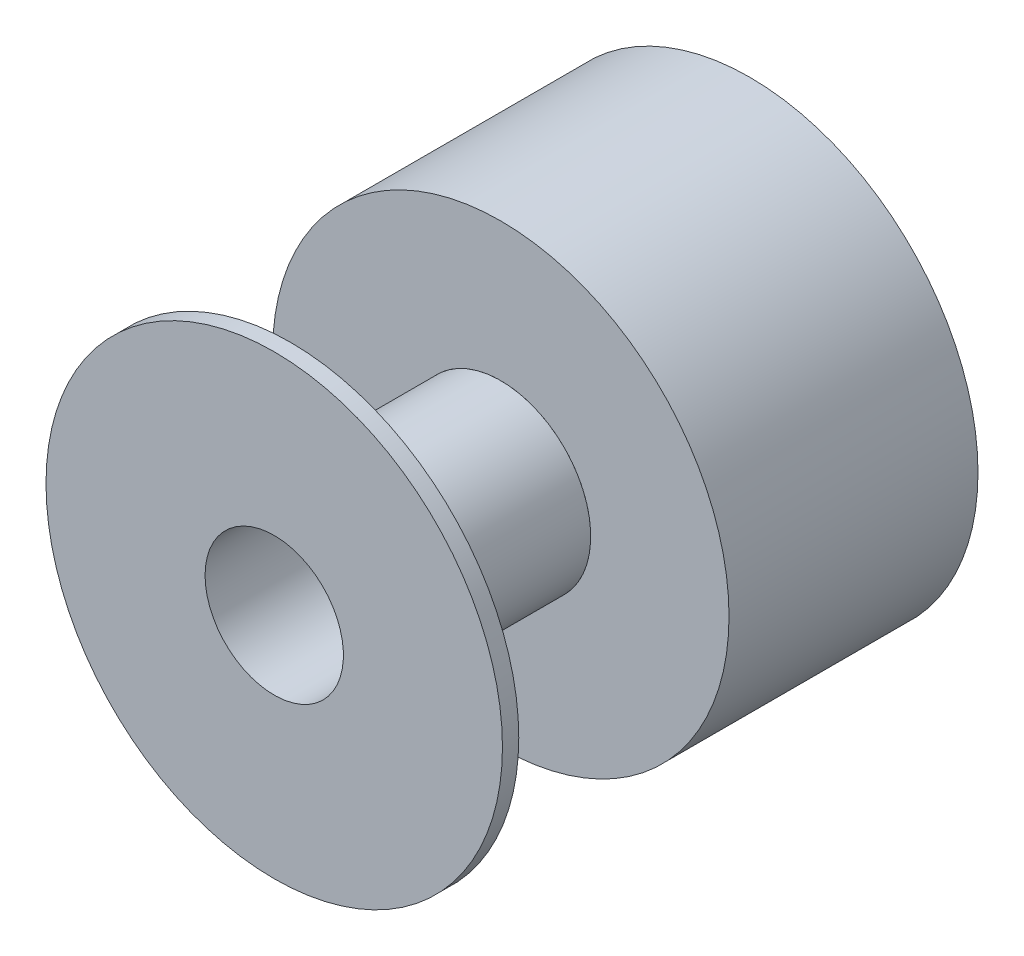
ISO-10303-21;
HEADER;
FILE_DESCRIPTION(('STEP AP214'),'2;1');
FILE_NAME('part.step','',(''),(''),'','','');
FILE_SCHEMA(('AUTOMOTIVE_DESIGN { 1 0 10303 214 1 1 1 1 }'));
ENDSEC;
DATA;
#1=APPLICATION_CONTEXT('core data for automotive mechanical design processes');
#2=APPLICATION_PROTOCOL_DEFINITION('international standard','automotive_design',2000,#1);
#3=PRODUCT_CONTEXT('',#1,'mechanical');
#4=PRODUCT('Part','Part','',(#3));
#5=PRODUCT_RELATED_PRODUCT_CATEGORY('part','',(#4));
#6=PRODUCT_DEFINITION_FORMATION('','',#4);
#7=PRODUCT_DEFINITION_CONTEXT('part definition',#1,'design');
#8=PRODUCT_DEFINITION('design','',#6,#7);
#9=PRODUCT_DEFINITION_SHAPE('','',#8);
#10=(LENGTH_UNIT() NAMED_UNIT(*) SI_UNIT(.MILLI.,.METRE.));
#11=(NAMED_UNIT(*) PLANE_ANGLE_UNIT() SI_UNIT($,.RADIAN.));
#12=(NAMED_UNIT(*) SI_UNIT($,.STERADIAN.) SOLID_ANGLE_UNIT());
#13=UNCERTAINTY_MEASURE_WITH_UNIT(LENGTH_MEASURE(1.E-05),#10,'distance_accuracy_value','');
#14=(GEOMETRIC_REPRESENTATION_CONTEXT(3) GLOBAL_UNCERTAINTY_ASSIGNED_CONTEXT((#13)) GLOBAL_UNIT_ASSIGNED_CONTEXT((#10,
#11,#12)) REPRESENTATION_CONTEXT('',''));
#15=CARTESIAN_POINT('',(0.,0.,0.));
#16=DIRECTION('',(0.,0.,1.));
#17=DIRECTION('',(1.,0.,0.));
#18=AXIS2_PLACEMENT_3D('',#15,#16,#17);
#19=CARTESIAN_POINT('',(0.,0.,-9.));
#20=DIRECTION('',(0.,0.,1.));
#21=DIRECTION('',(1.,0.,0.));
#22=AXIS2_PLACEMENT_3D('',#19,#20,#21);
#23=CYLINDRICAL_SURFACE('',#22,3.25);
#24=CARTESIAN_POINT('',(0.,0.,-9.));
#25=DIRECTION('',(0.,0.,1.));
#26=DIRECTION('',(1.,0.,0.));
#27=AXIS2_PLACEMENT_3D('',#24,#25,#26);
#28=CIRCLE('',#27,3.25);
#29=CARTESIAN_POINT('',(3.25,0.,-9.));
#30=VERTEX_POINT('',#29);
#31=EDGE_CURVE('E52',#30,#30,#28,.T.);
#32=ORIENTED_EDGE('',*,*,#31,.F.);
#33=EDGE_LOOP('',(#32));
#34=FACE_BOUND('',#33,.T.);
#35=CARTESIAN_POINT('',(0.,0.,0.));
#36=DIRECTION('',(0.,0.,1.));
#37=DIRECTION('',(1.,0.,0.));
#38=AXIS2_PLACEMENT_3D('',#35,#36,#37);
#39=CIRCLE('',#38,3.25);
#40=CARTESIAN_POINT('',(3.25,0.,0.));
#41=VERTEX_POINT('',#40);
#42=EDGE_CURVE('E58',#41,#41,#39,.T.);
#43=ORIENTED_EDGE('',*,*,#42,.T.);
#44=EDGE_LOOP('',(#43));
#45=FACE_BOUND('',#44,.T.);
#46=ADVANCED_FACE('F45',(#34,#45),#23,.F.);
#47=CARTESIAN_POINT('',(0.,0.,-9.));
#48=DIRECTION('',(0.,0.,1.));
#49=DIRECTION('',(1.,0.,0.));
#50=AXIS2_PLACEMENT_3D('',#47,#48,#49);
#51=CYLINDRICAL_SURFACE('',#50,8.25);
#52=CARTESIAN_POINT('',(0.,0.,-9.));
#53=DIRECTION('',(0.,0.,1.));
#54=DIRECTION('',(1.,0.,0.));
#55=AXIS2_PLACEMENT_3D('',#52,#53,#54);
#56=CIRCLE('',#55,8.25);
#57=CARTESIAN_POINT('',(8.25,0.,-9.));
#58=VERTEX_POINT('',#57);
#59=EDGE_CURVE('E11',#58,#58,#56,.T.);
#60=ORIENTED_EDGE('',*,*,#59,.T.);
#61=EDGE_LOOP('',(#60));
#62=FACE_BOUND('',#61,.T.);
#63=CARTESIAN_POINT('',(0.,0.,0.));
#64=DIRECTION('',(0.,0.,1.));
#65=DIRECTION('',(1.,0.,0.));
#66=AXIS2_PLACEMENT_3D('',#63,#64,#65);
#67=CIRCLE('',#66,8.25);
#68=CARTESIAN_POINT('',(8.25,0.,0.));
#69=VERTEX_POINT('',#68);
#70=EDGE_CURVE('E48',#69,#69,#67,.T.);
#71=ORIENTED_EDGE('',*,*,#70,.F.);
#72=EDGE_LOOP('',(#71));
#73=FACE_BOUND('',#72,.T.);
#74=ADVANCED_FACE('F67',(#62,#73),#51,.T.);
#75=CARTESIAN_POINT('',(0.,0.,-9.));
#76=DIRECTION('',(0.,0.,1.));
#77=DIRECTION('',(1.,0.,0.));
#78=AXIS2_PLACEMENT_3D('',#75,#76,#77);
#79=PLANE('',#78);
#80=ORIENTED_EDGE('',*,*,#31,.T.);
#81=EDGE_LOOP('',(#80));
#82=FACE_BOUND('',#81,.T.);
#83=ORIENTED_EDGE('',*,*,#59,.F.);
#84=EDGE_LOOP('',(#83));
#85=FACE_BOUND('',#84,.T.);
#86=ADVANCED_FACE('F69',(#82,#85),#79,.F.);
#87=CARTESIAN_POINT('',(0.,0.,0.));
#88=DIRECTION('',(0.,0.,1.));
#89=DIRECTION('',(1.,0.,0.));
#90=AXIS2_PLACEMENT_3D('',#87,#88,#89);
#91=PLANE('',#90);
#92=ORIENTED_EDGE('',*,*,#42,.F.);
#93=EDGE_LOOP('',(#92));
#94=FACE_BOUND('',#93,.T.);
#95=ORIENTED_EDGE('',*,*,#70,.T.);
#96=EDGE_LOOP('',(#95));
#97=FACE_BOUND('',#96,.T.);
#98=ADVANCED_FACE('F65',(#94,#97),#91,.T.);
#99=CLOSED_SHELL('',(#46,#74,#86,#98));
#100=MANIFOLD_SOLID_BREP('B2',#99);
#101=CARTESIAN_POINT('',(0.,0.,7.6));
#102=DIRECTION('',(0.,0.,-1.));
#103=DIRECTION('',(-1.,0.,0.));
#104=AXIS2_PLACEMENT_3D('',#101,#102,#103);
#105=CYLINDRICAL_SURFACE('',#104,2.5);
#106=CARTESIAN_POINT('',(0.,0.,0.));
#107=DIRECTION('',(0.,0.,1.));
#108=DIRECTION('',(1.,0.,0.));
#109=AXIS2_PLACEMENT_3D('',#106,#107,#108);
#110=CIRCLE('',#109,2.5);
#111=CARTESIAN_POINT('',(-2.5,0.,0.));
#112=VERTEX_POINT('',#111);
#113=EDGE_CURVE('E118',#112,#112,#110,.T.);
#114=CARTESIAN_POINT('',(0.,0.,8.19));
#115=DIRECTION('',(0.,0.,1.));
#116=DIRECTION('',(1.,0.,0.));
#117=AXIS2_PLACEMENT_3D('',#114,#115,#116);
#118=CIRCLE('',#117,2.5);
#119=CARTESIAN_POINT('',(-2.5,0.,8.19));
#120=VERTEX_POINT('',#119);
#121=EDGE_CURVE('E130',#120,#120,#118,.T.);
#122=CARTESIAN_POINT('',(-2.5,0.,0.));
#123=CARTESIAN_POINT('',(-2.5,0.,0.0853125000000001));
#124=CARTESIAN_POINT('',(-2.5,0.,0.170625));
#125=CARTESIAN_POINT('',(-2.5,0.,0.34125));
#126=CARTESIAN_POINT('',(-2.5,0.,0.4265625));
#127=CARTESIAN_POINT('',(-2.5,0.,0.5971875));
#128=CARTESIAN_POINT('',(-2.5,0.,0.6825));
#129=CARTESIAN_POINT('',(-2.5,0.,0.853125));
#130=CARTESIAN_POINT('',(-2.5,0.,0.9384375));
#131=CARTESIAN_POINT('',(-2.5,0.,1.1090625));
#132=CARTESIAN_POINT('',(-2.5,0.,1.194375));
#133=CARTESIAN_POINT('',(-2.5,0.,1.365));
#134=CARTESIAN_POINT('',(-2.5,0.,1.4503125));
#135=CARTESIAN_POINT('',(-2.5,0.,1.6209375));
#136=CARTESIAN_POINT('',(-2.5,0.,1.70625));
#137=CARTESIAN_POINT('',(-2.5,0.,1.876875));
#138=CARTESIAN_POINT('',(-2.5,0.,1.9621875));
#139=CARTESIAN_POINT('',(-2.5,0.,2.1328125));
#140=CARTESIAN_POINT('',(-2.5,0.,2.218125));
#141=CARTESIAN_POINT('',(-2.5,0.,2.38875));
#142=CARTESIAN_POINT('',(-2.5,0.,2.4740625));
#143=CARTESIAN_POINT('',(-2.5,0.,2.6446875));
#144=CARTESIAN_POINT('',(-2.5,0.,2.73));
#145=CARTESIAN_POINT('',(-2.5,0.,2.900625));
#146=CARTESIAN_POINT('',(-2.5,0.,2.9859375));
#147=CARTESIAN_POINT('',(-2.5,0.,3.1565625));
#148=CARTESIAN_POINT('',(-2.5,0.,3.241875));
#149=CARTESIAN_POINT('',(-2.5,0.,3.4125));
#150=CARTESIAN_POINT('',(-2.5,0.,3.4978125));
#151=CARTESIAN_POINT('',(-2.5,0.,3.6684375));
#152=CARTESIAN_POINT('',(-2.5,0.,3.75375));
#153=CARTESIAN_POINT('',(-2.5,0.,3.924375));
#154=CARTESIAN_POINT('',(-2.5,0.,4.0096875));
#155=CARTESIAN_POINT('',(-2.5,0.,4.1803125));
#156=CARTESIAN_POINT('',(-2.5,0.,4.265625));
#157=CARTESIAN_POINT('',(-2.5,0.,4.43625));
#158=CARTESIAN_POINT('',(-2.5,0.,4.5215625));
#159=CARTESIAN_POINT('',(-2.5,0.,4.6921875));
#160=CARTESIAN_POINT('',(-2.5,0.,4.7775));
#161=CARTESIAN_POINT('',(-2.5,0.,4.948125));
#162=CARTESIAN_POINT('',(-2.5,0.,5.0334375));
#163=CARTESIAN_POINT('',(-2.5,0.,5.2040625));
#164=CARTESIAN_POINT('',(-2.5,0.,5.289375));
#165=CARTESIAN_POINT('',(-2.5,0.,5.46));
#166=CARTESIAN_POINT('',(-2.5,0.,5.5453125));
#167=CARTESIAN_POINT('',(-2.5,0.,5.7159375));
#168=CARTESIAN_POINT('',(-2.5,0.,5.80125));
#169=CARTESIAN_POINT('',(-2.5,0.,5.971875));
#170=CARTESIAN_POINT('',(-2.5,0.,6.0571875));
#171=CARTESIAN_POINT('',(-2.5,0.,6.2278125));
#172=CARTESIAN_POINT('',(-2.5,0.,6.313125));
#173=CARTESIAN_POINT('',(-2.5,0.,6.48375));
#174=CARTESIAN_POINT('',(-2.5,0.,6.5690625));
#175=CARTESIAN_POINT('',(-2.5,0.,6.7396875));
#176=CARTESIAN_POINT('',(-2.5,0.,6.825));
#177=CARTESIAN_POINT('',(-2.5,0.,6.995625));
#178=CARTESIAN_POINT('',(-2.5,0.,7.0809375));
#179=CARTESIAN_POINT('',(-2.5,0.,7.2515625));
#180=CARTESIAN_POINT('',(-2.5,0.,7.336875));
#181=CARTESIAN_POINT('',(-2.5,0.,7.5075));
#182=CARTESIAN_POINT('',(-2.5,0.,7.5928125));
#183=CARTESIAN_POINT('',(-2.5,0.,7.7634375));
#184=CARTESIAN_POINT('',(-2.5,0.,7.84875));
#185=CARTESIAN_POINT('',(-2.5,0.,8.019375));
#186=CARTESIAN_POINT('',(-2.5,0.,8.1046875));
#187=CARTESIAN_POINT('',(-2.5,0.,8.19));
#188=B_SPLINE_CURVE_WITH_KNOTS('',3,(#122,#123,#124,#125,#126,#127,#128,#129,#130,#131,#132,
#133,#134,#135,#136,#137,#138,#139,#140,#141,#142,#143,#144,#145,#146,#147,#148,#149,#150,#151,
#152,#153,#154,#155,#156,#157,#158,#159,#160,#161,#162,#163,#164,#165,#166,#167,#168,#169,#170,
#171,#172,#173,#174,#175,#176,#177,#178,#179,#180,#181,#182,#183,#184,#185,#186,#187),
.UNSPECIFIED.,.F.,.F.,(4,2,2,2,2,2,2,2,2,2,2,2,2,2,2,2,2,2,2,2,2,2,2,2,2,2,2,2,2,2,2,2,4),(0.,
0.2559375,0.511875,0.7678125,1.02375,1.2796875,1.535625,1.7915625,2.0475,2.3034375,2.559375,
2.8153125,3.07125,3.3271875,3.583125,3.8390625,4.095,4.3509375,4.606875,4.8628125,5.11875,
5.3746875,5.630625,5.8865625,6.1425,6.3984375,6.654375,6.9103125,7.16625,7.4221875,7.678125,
7.9340625,8.19),.UNSPECIFIED.);
#189=EDGE_CURVE('BSEAM107',#112,#120,#188,.T.);
#190=ORIENTED_EDGE('',*,*,#113,.F.);
#191=ORIENTED_EDGE('',*,*,#121,.T.);
#192=ORIENTED_EDGE('',*,*,#189,.T.);
#193=ORIENTED_EDGE('',*,*,#189,.F.);
#194=EDGE_LOOP('',(#190,#192,#191,#193));
#195=FACE_BOUND('',#194,.T.);
#196=ADVANCED_FACE('F107',(#195),#105,.F.);
#197=CARTESIAN_POINT('',(0.,0.,7.6));
#198=DIRECTION('',(0.,0.,-1.));
#199=DIRECTION('',(-1.,0.,0.));
#200=AXIS2_PLACEMENT_3D('',#197,#198,#199);
#201=CYLINDRICAL_SURFACE('',#200,3.25);
#202=CARTESIAN_POINT('',(0.,0.,7.6));
#203=DIRECTION('',(0.,0.,1.));
#204=DIRECTION('',(1.,0.,0.));
#205=AXIS2_PLACEMENT_3D('',#202,#203,#204);
#206=CIRCLE('',#205,3.25);
#207=CARTESIAN_POINT('',(-3.25,0.,7.6));
#208=VERTEX_POINT('',#207);
#209=EDGE_CURVE('E44',#208,#208,#206,.T.);
#210=CARTESIAN_POINT('',(0.,0.,0.));
#211=DIRECTION('',(0.,0.,1.));
#212=DIRECTION('',(1.,0.,0.));
#213=AXIS2_PLACEMENT_3D('',#210,#211,#212);
#214=CIRCLE('',#213,3.25);
#215=CARTESIAN_POINT('',(-3.25,0.,0.));
#216=VERTEX_POINT('',#215);
#217=EDGE_CURVE('E110',#216,#216,#214,.T.);
#218=CARTESIAN_POINT('',(-3.25,0.,7.6));
#219=CARTESIAN_POINT('',(-3.25,0.,7.52083333333333));
#220=CARTESIAN_POINT('',(-3.25,0.,7.44166666666667));
#221=CARTESIAN_POINT('',(-3.25,0.,7.28333333333333));
#222=CARTESIAN_POINT('',(-3.25,0.,7.20416666666667));
#223=CARTESIAN_POINT('',(-3.25,0.,7.04583333333333));
#224=CARTESIAN_POINT('',(-3.25,0.,6.96666666666667));
#225=CARTESIAN_POINT('',(-3.25,0.,6.80833333333333));
#226=CARTESIAN_POINT('',(-3.25,0.,6.72916666666667));
#227=CARTESIAN_POINT('',(-3.25,0.,6.57083333333333));
#228=CARTESIAN_POINT('',(-3.25,0.,6.49166666666667));
#229=CARTESIAN_POINT('',(-3.25,0.,6.33333333333333));
#230=CARTESIAN_POINT('',(-3.25,0.,6.25416666666667));
#231=CARTESIAN_POINT('',(-3.25,0.,6.09583333333333));
#232=CARTESIAN_POINT('',(-3.25,0.,6.01666666666667));
#233=CARTESIAN_POINT('',(-3.25,0.,5.85833333333333));
#234=CARTESIAN_POINT('',(-3.25,0.,5.77916666666667));
#235=CARTESIAN_POINT('',(-3.25,0.,5.62083333333333));
#236=CARTESIAN_POINT('',(-3.25,0.,5.54166666666667));
#237=CARTESIAN_POINT('',(-3.25,0.,5.38333333333333));
#238=CARTESIAN_POINT('',(-3.25,0.,5.30416666666667));
#239=CARTESIAN_POINT('',(-3.25,0.,5.14583333333333));
#240=CARTESIAN_POINT('',(-3.25,0.,5.06666666666667));
#241=CARTESIAN_POINT('',(-3.25,0.,4.90833333333333));
#242=CARTESIAN_POINT('',(-3.25,0.,4.82916666666667));
#243=CARTESIAN_POINT('',(-3.25,0.,4.67083333333333));
#244=CARTESIAN_POINT('',(-3.25,0.,4.59166666666667));
#245=CARTESIAN_POINT('',(-3.25,0.,4.43333333333333));
#246=CARTESIAN_POINT('',(-3.25,0.,4.35416666666667));
#247=CARTESIAN_POINT('',(-3.25,0.,4.19583333333333));
#248=CARTESIAN_POINT('',(-3.25,0.,4.11666666666667));
#249=CARTESIAN_POINT('',(-3.25,0.,3.95833333333333));
#250=CARTESIAN_POINT('',(-3.25,0.,3.87916666666667));
#251=CARTESIAN_POINT('',(-3.25,0.,3.72083333333333));
#252=CARTESIAN_POINT('',(-3.25,0.,3.64166666666667));
#253=CARTESIAN_POINT('',(-3.25,0.,3.48333333333333));
#254=CARTESIAN_POINT('',(-3.25,0.,3.40416666666667));
#255=CARTESIAN_POINT('',(-3.25,0.,3.24583333333333));
#256=CARTESIAN_POINT('',(-3.25,0.,3.16666666666667));
#257=CARTESIAN_POINT('',(-3.25,0.,3.00833333333333));
#258=CARTESIAN_POINT('',(-3.25,0.,2.92916666666667));
#259=CARTESIAN_POINT('',(-3.25,0.,2.77083333333333));
#260=CARTESIAN_POINT('',(-3.25,0.,2.69166666666667));
#261=CARTESIAN_POINT('',(-3.25,0.,2.53333333333333));
#262=CARTESIAN_POINT('',(-3.25,0.,2.45416666666667));
#263=CARTESIAN_POINT('',(-3.25,0.,2.29583333333333));
#264=CARTESIAN_POINT('',(-3.25,0.,2.21666666666667));
#265=CARTESIAN_POINT('',(-3.25,0.,2.05833333333333));
#266=CARTESIAN_POINT('',(-3.25,0.,1.97916666666667));
#267=CARTESIAN_POINT('',(-3.25,0.,1.82083333333333));
#268=CARTESIAN_POINT('',(-3.25,0.,1.74166666666667));
#269=CARTESIAN_POINT('',(-3.25,0.,1.58333333333333));
#270=CARTESIAN_POINT('',(-3.25,0.,1.50416666666667));
#271=CARTESIAN_POINT('',(-3.25,0.,1.34583333333333));
#272=CARTESIAN_POINT('',(-3.25,0.,1.26666666666667));
#273=CARTESIAN_POINT('',(-3.25,0.,1.10833333333333));
#274=CARTESIAN_POINT('',(-3.25,0.,1.02916666666667));
#275=CARTESIAN_POINT('',(-3.25,0.,0.870833333333333));
#276=CARTESIAN_POINT('',(-3.25,0.,0.791666666666667));
#277=CARTESIAN_POINT('',(-3.25,0.,0.633333333333333));
#278=CARTESIAN_POINT('',(-3.25,0.,0.554166666666666));
#279=CARTESIAN_POINT('',(-3.25,0.,0.395833333333333));
#280=CARTESIAN_POINT('',(-3.25,0.,0.316666666666667));
#281=CARTESIAN_POINT('',(-3.25,0.,0.158333333333333));
#282=CARTESIAN_POINT('',(-3.25,0.,0.0791666666666665));
#283=CARTESIAN_POINT('',(-3.25,0.,0.));
#284=B_SPLINE_CURVE_WITH_KNOTS('',3,(#218,#219,#220,#221,#222,#223,#224,#225,#226,#227,#228,
#229,#230,#231,#232,#233,#234,#235,#236,#237,#238,#239,#240,#241,#242,#243,#244,#245,#246,#247,
#248,#249,#250,#251,#252,#253,#254,#255,#256,#257,#258,#259,#260,#261,#262,#263,#264,#265,#266,
#267,#268,#269,#270,#271,#272,#273,#274,#275,#276,#277,#278,#279,#280,#281,#282,#283),
.UNSPECIFIED.,.F.,.F.,(4,2,2,2,2,2,2,2,2,2,2,2,2,2,2,2,2,2,2,2,2,2,2,2,2,2,2,2,2,2,2,2,4),(0.,
0.2375,0.475,0.7125,0.95,1.1875,1.425,1.6625,1.9,2.1375,2.375,2.6125,2.85,3.0875,3.325,3.5625,
3.8,4.0375,4.275,4.5125,4.75,4.9875,5.225,5.4625,5.7,5.9375,6.175,6.4125,6.65,6.8875,7.125,
7.3625,7.6),.UNSPECIFIED.);
#285=EDGE_CURVE('BSEAM151',#208,#216,#284,.T.);
#286=ORIENTED_EDGE('',*,*,#209,.F.);
#287=ORIENTED_EDGE('',*,*,#217,.T.);
#288=ORIENTED_EDGE('',*,*,#285,.T.);
#289=ORIENTED_EDGE('',*,*,#285,.F.);
#290=EDGE_LOOP('',(#286,#288,#287,#289));
#291=FACE_BOUND('',#290,.T.);
#292=ADVANCED_FACE('F151',(#291),#201,.T.);
#293=CARTESIAN_POINT('',(0.,0.,0.));
#294=DIRECTION('',(0.,0.,1.));
#295=DIRECTION('',(1.,0.,0.));
#296=AXIS2_PLACEMENT_3D('',#293,#294,#295);
#297=PLANE('',#296);
#298=ORIENTED_EDGE('',*,*,#113,.T.);
#299=EDGE_LOOP('',(#298));
#300=FACE_BOUND('',#299,.T.);
#301=ORIENTED_EDGE('',*,*,#217,.F.);
#302=EDGE_LOOP('',(#301));
#303=FACE_BOUND('',#302,.T.);
#304=ADVANCED_FACE('F147',(#300,#303),#297,.F.);
#305=CARTESIAN_POINT('',(0.,0.,7.6));
#306=DIRECTION('',(0.,0.,1.));
#307=DIRECTION('',(1.,0.,0.));
#308=AXIS2_PLACEMENT_3D('',#305,#306,#307);
#309=PLANE('',#308);
#310=CARTESIAN_POINT('',(0.,0.,7.6));
#311=DIRECTION('',(0.,0.,1.));
#312=DIRECTION('',(1.,0.,0.));
#313=AXIS2_PLACEMENT_3D('',#310,#311,#312);
#314=CIRCLE('',#313,8.25);
#315=CARTESIAN_POINT('',(8.25,0.,7.6));
#316=VERTEX_POINT('',#315);
#317=EDGE_CURVE('E120',#316,#316,#314,.T.);
#318=ORIENTED_EDGE('',*,*,#317,.F.);
#319=EDGE_LOOP('',(#318));
#320=FACE_BOUND('',#319,.T.);
#321=ORIENTED_EDGE('',*,*,#209,.T.);
#322=EDGE_LOOP('',(#321));
#323=FACE_BOUND('',#322,.T.);
#324=ADVANCED_FACE('F139',(#320,#323),#309,.F.);
#325=CARTESIAN_POINT('',(0.,0.,8.19));
#326=DIRECTION('',(0.,0.,1.));
#327=DIRECTION('',(1.,0.,0.));
#328=AXIS2_PLACEMENT_3D('',#325,#326,#327);
#329=PLANE('',#328);
#330=CARTESIAN_POINT('',(0.,0.,8.19));
#331=DIRECTION('',(0.,0.,1.));
#332=DIRECTION('',(1.,0.,0.));
#333=AXIS2_PLACEMENT_3D('',#330,#331,#332);
#334=CIRCLE('',#333,8.25);
#335=CARTESIAN_POINT('',(8.25,0.,8.19));
#336=VERTEX_POINT('',#335);
#337=EDGE_CURVE('E123',#336,#336,#334,.T.);
#338=ORIENTED_EDGE('',*,*,#337,.T.);
#339=EDGE_LOOP('',(#338));
#340=FACE_BOUND('',#339,.T.);
#341=ORIENTED_EDGE('',*,*,#121,.F.);
#342=EDGE_LOOP('',(#341));
#343=FACE_BOUND('',#342,.T.);
#344=ADVANCED_FACE('F136',(#340,#343),#329,.T.);
#345=CARTESIAN_POINT('',(0.,0.,8.19));
#346=DIRECTION('',(0.,0.,-1.));
#347=DIRECTION('',(-1.,0.,0.));
#348=AXIS2_PLACEMENT_3D('',#345,#346,#347);
#349=CYLINDRICAL_SURFACE('',#348,8.25);
#350=ORIENTED_EDGE('',*,*,#337,.F.);
#351=EDGE_LOOP('',(#350));
#352=FACE_BOUND('',#351,.T.);
#353=ORIENTED_EDGE('',*,*,#317,.T.);
#354=EDGE_LOOP('',(#353));
#355=FACE_BOUND('',#354,.T.);
#356=ADVANCED_FACE('F138',(#352,#355),#349,.T.);
#357=CLOSED_SHELL('',(#196,#292,#304,#324,#344,#356));
#358=MANIFOLD_SOLID_BREP('B6',#357);
#359=ADVANCED_BREP_SHAPE_REPRESENTATION('',(#18,#100,#358),#14);
#360=SHAPE_DEFINITION_REPRESENTATION(#9,#359);
ENDSEC;
END-ISO-10303-21;
